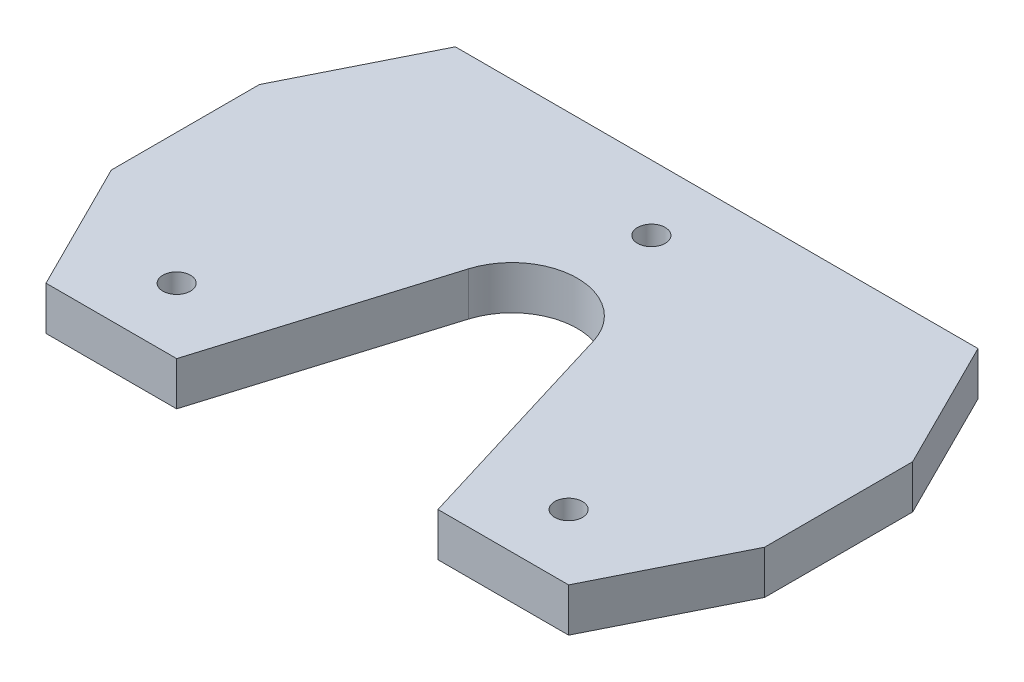
ISO-10303-21;
HEADER;
FILE_DESCRIPTION(('STEP AP214'),'2;1');
FILE_NAME('part.step','',(''),(''),'','','');
FILE_SCHEMA(('AUTOMOTIVE_DESIGN { 1 0 10303 214 1 1 1 1 }'));
ENDSEC;
DATA;
#1=APPLICATION_CONTEXT('core data for automotive mechanical design processes');
#2=APPLICATION_PROTOCOL_DEFINITION('international standard','automotive_design',2000,#1);
#3=PRODUCT_CONTEXT('',#1,'mechanical');
#4=PRODUCT('Part','Part','',(#3));
#5=PRODUCT_RELATED_PRODUCT_CATEGORY('part','',(#4));
#6=PRODUCT_DEFINITION_FORMATION('','',#4);
#7=PRODUCT_DEFINITION_CONTEXT('part definition',#1,'design');
#8=PRODUCT_DEFINITION('design','',#6,#7);
#9=PRODUCT_DEFINITION_SHAPE('','',#8);
#10=(LENGTH_UNIT() NAMED_UNIT(*) SI_UNIT(.MILLI.,.METRE.));
#11=(NAMED_UNIT(*) PLANE_ANGLE_UNIT() SI_UNIT($,.RADIAN.));
#12=(NAMED_UNIT(*) SI_UNIT($,.STERADIAN.) SOLID_ANGLE_UNIT());
#13=UNCERTAINTY_MEASURE_WITH_UNIT(LENGTH_MEASURE(1.E-05),#10,'distance_accuracy_value','');
#14=(GEOMETRIC_REPRESENTATION_CONTEXT(3) GLOBAL_UNCERTAINTY_ASSIGNED_CONTEXT((#13)) GLOBAL_UNIT_ASSIGNED_CONTEXT((#10,
#11,#12)) REPRESENTATION_CONTEXT('',''));
#15=CARTESIAN_POINT('',(0.,0.,0.));
#16=DIRECTION('',(0.,0.,1.));
#17=DIRECTION('',(1.,0.,0.));
#18=AXIS2_PLACEMENT_3D('',#15,#16,#17);
#19=CARTESIAN_POINT('',(-0.0001683117060666,10.,19.6990291262136));
#20=DIRECTION('',(0.,1.,0.));
#21=DIRECTION('',(0.,0.,1.));
#22=AXIS2_PLACEMENT_3D('',#19,#20,#21);
#23=PLANE('',#22);
#24=CARTESIAN_POINT('',(0.,10.,-12.3009708737864));
#25=DIRECTION('',(0.,1.,0.));
#26=DIRECTION('',(0.,0.,1.));
#27=AXIS2_PLACEMENT_3D('',#24,#25,#26);
#28=CIRCLE('',#27,3.175);
#29=CARTESIAN_POINT('',(0.,10.,-9.12597087378638));
#30=VERTEX_POINT('',#29);
#31=EDGE_CURVE('E286',#30,#30,#28,.T.);
#32=ORIENTED_EDGE('',*,*,#31,.F.);
#33=EDGE_LOOP('',(#32));
#34=FACE_BOUND('',#33,.T.);
#35=DIRECTION('',(-0.447213595499958,0.,0.894427190999916));
#36=VECTOR('',#35,1.);
#37=CARTESIAN_POINT('',(-60.,10.,-27.3009708737864));
#38=LINE('',#37,#36);
#39=CARTESIAN_POINT('',(-60.,10.,-27.3009708737864));
#40=VERTEX_POINT('',#39);
#41=CARTESIAN_POINT('',(-75.,10.,2.69902912621361));
#42=VERTEX_POINT('',#41);
#43=EDGE_CURVE('E177',#40,#42,#38,.T.);
#44=ORIENTED_EDGE('',*,*,#43,.T.);
#45=DIRECTION('',(0.,0.,1.));
#46=VECTOR('',#45,1.);
#47=CARTESIAN_POINT('',(-75.,10.,2.69902912621361));
#48=LINE('',#47,#46);
#49=CARTESIAN_POINT('',(-75.,10.,36.6990291262136));
#50=VERTEX_POINT('',#49);
#51=EDGE_CURVE('E105',#42,#50,#48,.T.);
#52=ORIENTED_EDGE('',*,*,#51,.T.);
#53=DIRECTION('',(0.447213595499958,0.,0.894427190999916));
#54=VECTOR('',#53,1.);
#55=CARTESIAN_POINT('',(-75.,10.,36.6990291262136));
#56=LINE('',#55,#54);
#57=CARTESIAN_POINT('',(-60.,10.,66.6990291262136));
#58=VERTEX_POINT('',#57);
#59=EDGE_CURVE('E204',#50,#58,#56,.T.);
#60=ORIENTED_EDGE('',*,*,#59,.T.);
#61=DIRECTION('',(1.,0.,0.));
#62=VECTOR('',#61,1.);
#63=CARTESIAN_POINT('',(-60.,10.,66.6990291262136));
#64=LINE('',#63,#62);
#65=CARTESIAN_POINT('',(-30.,10.,66.6990291262136));
#66=VERTEX_POINT('',#65);
#67=EDGE_CURVE('E223',#58,#66,#64,.T.);
#68=ORIENTED_EDGE('',*,*,#67,.T.);
#69=DIRECTION('',(0.291437013014146,0.,-0.956590020565442));
#70=VECTOR('',#69,1.);
#71=CARTESIAN_POINT('',(-30.,10.,66.6990291262136));
#72=LINE('',#71,#70);
#73=CARTESIAN_POINT('',(-14.3490186201877,10.,15.3274739310014));
#74=VERTEX_POINT('',#73);
#75=EDGE_CURVE('E220',#66,#74,#72,.T.);
#76=ORIENTED_EDGE('',*,*,#75,.T.);
#77=CARTESIAN_POINT('',(-0.0001683117060666,10.,19.6990291262136));
#78=DIRECTION('',(0.,-1.,0.));
#79=DIRECTION('',(0.,0.,1.));
#80=AXIS2_PLACEMENT_3D('',#77,#78,#79);
#81=CIRCLE('',#80,15.);
#82=CARTESIAN_POINT('',(14.348655784038,10.,15.3273878932905));
#83=VERTEX_POINT('',#82);
#84=EDGE_CURVE('E222',#74,#83,#81,.T.);
#85=ORIENTED_EDGE('',*,*,#84,.T.);
#86=DIRECTION('',(0.291442748861541,0.,0.956588273049607));
#87=VECTOR('',#86,1.);
#88=CARTESIAN_POINT('',(30.,10.,66.6990291262136));
#89=LINE('',#88,#87);
#90=CARTESIAN_POINT('',(30.,10.,66.6990291262136));
#91=VERTEX_POINT('',#90);
#92=EDGE_CURVE('E225',#83,#91,#89,.T.);
#93=ORIENTED_EDGE('',*,*,#92,.T.);
#94=DIRECTION('',(1.,0.,0.));
#95=VECTOR('',#94,1.);
#96=CARTESIAN_POINT('',(60.,10.,66.6990291262136));
#97=LINE('',#96,#95);
#98=CARTESIAN_POINT('',(60.,10.,66.6990291262136));
#99=VERTEX_POINT('',#98);
#100=EDGE_CURVE('E231',#91,#99,#97,.T.);
#101=ORIENTED_EDGE('',*,*,#100,.T.);
#102=DIRECTION('',(0.447213595499958,0.,-0.894427190999916));
#103=VECTOR('',#102,1.);
#104=CARTESIAN_POINT('',(75.,10.,36.6990291262136));
#105=LINE('',#104,#103);
#106=CARTESIAN_POINT('',(75.,10.,36.6990291262136));
#107=VERTEX_POINT('',#106);
#108=EDGE_CURVE('E136',#99,#107,#105,.T.);
#109=ORIENTED_EDGE('',*,*,#108,.T.);
#110=DIRECTION('',(0.,0.,-1.));
#111=VECTOR('',#110,1.);
#112=CARTESIAN_POINT('',(75.,10.,2.69902912621361));
#113=LINE('',#112,#111);
#114=CARTESIAN_POINT('',(75.,10.,2.69902912621361));
#115=VERTEX_POINT('',#114);
#116=EDGE_CURVE('E130',#107,#115,#113,.T.);
#117=ORIENTED_EDGE('',*,*,#116,.T.);
#118=DIRECTION('',(-0.447213595499958,0.,-0.894427190999916));
#119=VECTOR('',#118,1.);
#120=CARTESIAN_POINT('',(60.,10.,-27.3009708737864));
#121=LINE('',#120,#119);
#122=CARTESIAN_POINT('',(60.,10.,-27.3009708737864));
#123=VERTEX_POINT('',#122);
#124=EDGE_CURVE('E134',#115,#123,#121,.T.);
#125=ORIENTED_EDGE('',*,*,#124,.T.);
#126=DIRECTION('',(-1.,0.,0.));
#127=VECTOR('',#126,1.);
#128=CARTESIAN_POINT('',(-60.,10.,-27.3009708737864));
#129=LINE('',#128,#127);
#130=EDGE_CURVE('E50',#123,#40,#129,.T.);
#131=ORIENTED_EDGE('',*,*,#130,.T.);
#132=EDGE_LOOP('',(#44,#52,#60,#68,#76,#85,#93,#101,#109,#117,#125,#131));
#133=FACE_BOUND('',#132,.T.);
#134=CARTESIAN_POINT('',(-45.,10.,51.6990291262136));
#135=DIRECTION('',(0.,1.,0.));
#136=DIRECTION('',(0.,0.,1.));
#137=AXIS2_PLACEMENT_3D('',#134,#135,#136);
#138=CIRCLE('',#137,3.175);
#139=CARTESIAN_POINT('',(-45.,10.,54.8740291262136));
#140=VERTEX_POINT('',#139);
#141=EDGE_CURVE('E158',#140,#140,#138,.T.);
#142=ORIENTED_EDGE('',*,*,#141,.F.);
#143=EDGE_LOOP('',(#142));
#144=FACE_BOUND('',#143,.T.);
#145=CARTESIAN_POINT('',(45.,10.,51.6990291262136));
#146=DIRECTION('',(0.,1.,0.));
#147=DIRECTION('',(0.,0.,1.));
#148=AXIS2_PLACEMENT_3D('',#145,#146,#147);
#149=CIRCLE('',#148,3.175);
#150=CARTESIAN_POINT('',(45.,10.,54.8740291262136));
#151=VERTEX_POINT('',#150);
#152=EDGE_CURVE('E277',#151,#151,#149,.T.);
#153=ORIENTED_EDGE('',*,*,#152,.F.);
#154=EDGE_LOOP('',(#153));
#155=FACE_BOUND('',#154,.T.);
#156=ADVANCED_FACE('F33',(#34,#133,#144,#155),#23,.T.);
#157=CARTESIAN_POINT('',(-0.0001683117060666,0.,19.6990291262136));
#158=DIRECTION('',(0.,1.,0.));
#159=DIRECTION('',(0.,0.,1.));
#160=AXIS2_PLACEMENT_3D('',#157,#158,#159);
#161=PLANE('',#160);
#162=DIRECTION('',(-0.447213595499958,0.,0.894427190999916));
#163=VECTOR('',#162,1.);
#164=CARTESIAN_POINT('',(-60.,0.,-27.3009708737864));
#165=LINE('',#164,#163);
#166=CARTESIAN_POINT('',(-60.,0.,-27.3009708737864));
#167=VERTEX_POINT('',#166);
#168=CARTESIAN_POINT('',(-75.,0.,2.69902912621361));
#169=VERTEX_POINT('',#168);
#170=EDGE_CURVE('E154',#167,#169,#165,.T.);
#171=ORIENTED_EDGE('',*,*,#170,.F.);
#172=DIRECTION('',(-1.,0.,0.));
#173=VECTOR('',#172,1.);
#174=CARTESIAN_POINT('',(-60.,0.,-27.3009708737864));
#175=LINE('',#174,#173);
#176=CARTESIAN_POINT('',(60.,0.,-27.3009708737864));
#177=VERTEX_POINT('',#176);
#178=EDGE_CURVE('E97',#177,#167,#175,.T.);
#179=ORIENTED_EDGE('',*,*,#178,.F.);
#180=DIRECTION('',(-0.447213595499958,0.,-0.894427190999916));
#181=VECTOR('',#180,1.);
#182=CARTESIAN_POINT('',(60.,0.,-27.3009708737864));
#183=LINE('',#182,#181);
#184=CARTESIAN_POINT('',(75.,0.,2.69902912621361));
#185=VERTEX_POINT('',#184);
#186=EDGE_CURVE('E91',#185,#177,#183,.T.);
#187=ORIENTED_EDGE('',*,*,#186,.F.);
#188=DIRECTION('',(0.,0.,-1.));
#189=VECTOR('',#188,1.);
#190=CARTESIAN_POINT('',(75.,0.,2.69902912621361));
#191=LINE('',#190,#189);
#192=CARTESIAN_POINT('',(75.,0.,36.6990291262136));
#193=VERTEX_POINT('',#192);
#194=EDGE_CURVE('E144',#193,#185,#191,.T.);
#195=ORIENTED_EDGE('',*,*,#194,.F.);
#196=DIRECTION('',(0.447213595499958,0.,-0.894427190999916));
#197=VECTOR('',#196,1.);
#198=CARTESIAN_POINT('',(75.,0.,36.6990291262136));
#199=LINE('',#198,#197);
#200=CARTESIAN_POINT('',(60.,0.,66.6990291262136));
#201=VERTEX_POINT('',#200);
#202=EDGE_CURVE('E172',#201,#193,#199,.T.);
#203=ORIENTED_EDGE('',*,*,#202,.F.);
#204=DIRECTION('',(1.,0.,0.));
#205=VECTOR('',#204,1.);
#206=CARTESIAN_POINT('',(60.,0.,66.6990291262136));
#207=LINE('',#206,#205);
#208=CARTESIAN_POINT('',(30.,0.,66.6990291262136));
#209=VERTEX_POINT('',#208);
#210=EDGE_CURVE('E170',#209,#201,#207,.T.);
#211=ORIENTED_EDGE('',*,*,#210,.F.);
#212=DIRECTION('',(0.291442748861541,0.,0.956588273049607));
#213=VECTOR('',#212,1.);
#214=CARTESIAN_POINT('',(30.,0.,66.6990291262136));
#215=LINE('',#214,#213);
#216=CARTESIAN_POINT('',(14.348655784038,0.,15.3273878932905));
#217=VERTEX_POINT('',#216);
#218=EDGE_CURVE('E168',#217,#209,#215,.T.);
#219=ORIENTED_EDGE('',*,*,#218,.F.);
#220=CARTESIAN_POINT('',(-0.0001683117060666,0.,19.6990291262136));
#221=DIRECTION('',(0.,-1.,0.));
#222=DIRECTION('',(0.,0.,1.));
#223=AXIS2_PLACEMENT_3D('',#220,#221,#222);
#224=CIRCLE('',#223,15.);
#225=CARTESIAN_POINT('',(-14.3490186201877,0.,15.3274739310014));
#226=VERTEX_POINT('',#225);
#227=EDGE_CURVE('E166',#226,#217,#224,.T.);
#228=ORIENTED_EDGE('',*,*,#227,.F.);
#229=DIRECTION('',(0.291437013014146,0.,-0.956590020565442));
#230=VECTOR('',#229,1.);
#231=CARTESIAN_POINT('',(-30.,0.,66.6990291262136));
#232=LINE('',#231,#230);
#233=CARTESIAN_POINT('',(-30.,0.,66.6990291262136));
#234=VERTEX_POINT('',#233);
#235=EDGE_CURVE('E164',#234,#226,#232,.T.);
#236=ORIENTED_EDGE('',*,*,#235,.F.);
#237=DIRECTION('',(1.,0.,0.));
#238=VECTOR('',#237,1.);
#239=CARTESIAN_POINT('',(-60.,0.,66.6990291262136));
#240=LINE('',#239,#238);
#241=CARTESIAN_POINT('',(-60.,0.,66.6990291262136));
#242=VERTEX_POINT('',#241);
#243=EDGE_CURVE('E162',#242,#234,#240,.T.);
#244=ORIENTED_EDGE('',*,*,#243,.F.);
#245=DIRECTION('',(0.447213595499958,0.,0.894427190999916));
#246=VECTOR('',#245,1.);
#247=CARTESIAN_POINT('',(-75.,0.,36.6990291262136));
#248=LINE('',#247,#246);
#249=CARTESIAN_POINT('',(-75.,0.,36.6990291262136));
#250=VERTEX_POINT('',#249);
#251=EDGE_CURVE('E160',#250,#242,#248,.T.);
#252=ORIENTED_EDGE('',*,*,#251,.F.);
#253=DIRECTION('',(0.,0.,1.));
#254=VECTOR('',#253,1.);
#255=CARTESIAN_POINT('',(-75.,0.,2.69902912621361));
#256=LINE('',#255,#254);
#257=EDGE_CURVE('E157',#169,#250,#256,.T.);
#258=ORIENTED_EDGE('',*,*,#257,.F.);
#259=EDGE_LOOP('',(#171,#179,#187,#195,#203,#211,#219,#228,#236,#244,#252,#258));
#260=FACE_BOUND('',#259,.T.);
#261=CARTESIAN_POINT('',(-45.,0.,51.6990291262136));
#262=DIRECTION('',(0.,1.,0.));
#263=DIRECTION('',(0.,0.,1.));
#264=AXIS2_PLACEMENT_3D('',#261,#262,#263);
#265=CIRCLE('',#264,3.175);
#266=CARTESIAN_POINT('',(-45.,0.,54.8740291262136));
#267=VERTEX_POINT('',#266);
#268=EDGE_CURVE('E289',#267,#267,#265,.T.);
#269=ORIENTED_EDGE('',*,*,#268,.T.);
#270=EDGE_LOOP('',(#269));
#271=FACE_BOUND('',#270,.T.);
#272=CARTESIAN_POINT('',(0.,0.,-12.3009708737864));
#273=DIRECTION('',(0.,1.,0.));
#274=DIRECTION('',(0.,0.,1.));
#275=AXIS2_PLACEMENT_3D('',#272,#273,#274);
#276=CIRCLE('',#275,3.175);
#277=CARTESIAN_POINT('',(0.,0.,-9.12597087378638));
#278=VERTEX_POINT('',#277);
#279=EDGE_CURVE('E283',#278,#278,#276,.T.);
#280=ORIENTED_EDGE('',*,*,#279,.T.);
#281=EDGE_LOOP('',(#280));
#282=FACE_BOUND('',#281,.T.);
#283=CARTESIAN_POINT('',(45.,0.,51.6990291262136));
#284=DIRECTION('',(0.,1.,0.));
#285=DIRECTION('',(0.,0.,1.));
#286=AXIS2_PLACEMENT_3D('',#283,#284,#285);
#287=CIRCLE('',#286,3.175);
#288=CARTESIAN_POINT('',(45.,0.,54.8740291262136));
#289=VERTEX_POINT('',#288);
#290=EDGE_CURVE('E280',#289,#289,#287,.T.);
#291=ORIENTED_EDGE('',*,*,#290,.T.);
#292=EDGE_LOOP('',(#291));
#293=FACE_BOUND('',#292,.T.);
#294=ADVANCED_FACE('F208',(#260,#271,#282,#293),#161,.F.);
#295=CARTESIAN_POINT('',(-60.,10.,-27.3009708737864));
#296=DIRECTION('',(0.894427190999916,0.,0.447213595499958));
#297=DIRECTION('',(0.447213595499958,0.,-0.894427190999916));
#298=AXIS2_PLACEMENT_3D('',#295,#296,#297);
#299=PLANE('',#298);
#300=ORIENTED_EDGE('',*,*,#170,.T.);
#301=DIRECTION('',(0.,-1.,0.));
#302=VECTOR('',#301,1.);
#303=CARTESIAN_POINT('',(-75.,10.,2.69902912621361));
#304=LINE('',#303,#302);
#305=EDGE_CURVE('E11',#42,#169,#304,.T.);
#306=ORIENTED_EDGE('',*,*,#305,.F.);
#307=ORIENTED_EDGE('',*,*,#43,.F.);
#308=DIRECTION('',(0.,-1.,0.));
#309=VECTOR('',#308,1.);
#310=CARTESIAN_POINT('',(-60.,10.,-27.3009708737864));
#311=LINE('',#310,#309);
#312=EDGE_CURVE('E150',#40,#167,#311,.T.);
#313=ORIENTED_EDGE('',*,*,#312,.T.);
#314=EDGE_LOOP('',(#300,#306,#307,#313));
#315=FACE_BOUND('',#314,.T.);
#316=ADVANCED_FACE('F35',(#315),#299,.F.);
#317=CARTESIAN_POINT('',(-75.,10.,2.69902912621361));
#318=DIRECTION('',(1.,0.,0.));
#319=DIRECTION('',(0.,0.,-1.));
#320=AXIS2_PLACEMENT_3D('',#317,#318,#319);
#321=PLANE('',#320);
#322=ORIENTED_EDGE('',*,*,#257,.T.);
#323=DIRECTION('',(0.,-1.,0.));
#324=VECTOR('',#323,1.);
#325=CARTESIAN_POINT('',(-75.,10.,36.6990291262136));
#326=LINE('',#325,#324);
#327=EDGE_CURVE('E42',#50,#250,#326,.T.);
#328=ORIENTED_EDGE('',*,*,#327,.F.);
#329=ORIENTED_EDGE('',*,*,#51,.F.);
#330=ORIENTED_EDGE('',*,*,#305,.T.);
#331=EDGE_LOOP('',(#322,#328,#329,#330));
#332=FACE_BOUND('',#331,.T.);
#333=ADVANCED_FACE('F391',(#332),#321,.F.);
#334=CARTESIAN_POINT('',(-75.,10.,36.6990291262136));
#335=DIRECTION('',(0.894427190999916,0.,-0.447213595499958));
#336=DIRECTION('',(-0.447213595499958,0.,-0.894427190999916));
#337=AXIS2_PLACEMENT_3D('',#334,#335,#336);
#338=PLANE('',#337);
#339=ORIENTED_EDGE('',*,*,#251,.T.);
#340=DIRECTION('',(0.,-1.,0.));
#341=VECTOR('',#340,1.);
#342=CARTESIAN_POINT('',(-60.,10.,66.6990291262136));
#343=LINE('',#342,#341);
#344=EDGE_CURVE('E196',#58,#242,#343,.T.);
#345=ORIENTED_EDGE('',*,*,#344,.F.);
#346=ORIENTED_EDGE('',*,*,#59,.F.);
#347=ORIENTED_EDGE('',*,*,#327,.T.);
#348=EDGE_LOOP('',(#339,#345,#346,#347));
#349=FACE_BOUND('',#348,.T.);
#350=ADVANCED_FACE('F202',(#349),#338,.F.);
#351=CARTESIAN_POINT('',(-60.,10.,66.6990291262136));
#352=DIRECTION('',(0.,0.,-1.));
#353=DIRECTION('',(-1.,0.,0.));
#354=AXIS2_PLACEMENT_3D('',#351,#352,#353);
#355=PLANE('',#354);
#356=ORIENTED_EDGE('',*,*,#243,.T.);
#357=DIRECTION('',(0.,-1.,0.));
#358=VECTOR('',#357,1.);
#359=CARTESIAN_POINT('',(-30.,10.,66.6990291262136));
#360=LINE('',#359,#358);
#361=EDGE_CURVE('E193',#66,#234,#360,.T.);
#362=ORIENTED_EDGE('',*,*,#361,.F.);
#363=ORIENTED_EDGE('',*,*,#67,.F.);
#364=ORIENTED_EDGE('',*,*,#344,.T.);
#365=EDGE_LOOP('',(#356,#362,#363,#364));
#366=FACE_BOUND('',#365,.T.);
#367=ADVANCED_FACE('F214',(#366),#355,.F.);
#368=CARTESIAN_POINT('',(-30.,10.,66.6990291262136));
#369=DIRECTION('',(-0.956590020565442,0.,-0.291437013014146));
#370=DIRECTION('',(-0.291437013014146,0.,0.956590020565442));
#371=AXIS2_PLACEMENT_3D('',#368,#369,#370);
#372=PLANE('',#371);
#373=ORIENTED_EDGE('',*,*,#235,.T.);
#374=DIRECTION('',(0.,-1.,0.));
#375=VECTOR('',#374,1.);
#376=CARTESIAN_POINT('',(-14.3490186201877,10.,15.3274739310014));
#377=LINE('',#376,#375);
#378=EDGE_CURVE('E190',#74,#226,#377,.T.);
#379=ORIENTED_EDGE('',*,*,#378,.F.);
#380=ORIENTED_EDGE('',*,*,#75,.F.);
#381=ORIENTED_EDGE('',*,*,#361,.T.);
#382=EDGE_LOOP('',(#373,#379,#380,#381));
#383=FACE_BOUND('',#382,.T.);
#384=ADVANCED_FACE('F218',(#383),#372,.F.);
#385=CARTESIAN_POINT('',(-0.0001683117060666,10.,19.6990291262136));
#386=DIRECTION('',(0.,-1.,0.));
#387=DIRECTION('',(0.,0.,-1.));
#388=AXIS2_PLACEMENT_3D('',#385,#386,#387);
#389=CYLINDRICAL_SURFACE('',#388,15.);
#390=ORIENTED_EDGE('',*,*,#227,.T.);
#391=DIRECTION('',(0.,-1.,0.));
#392=VECTOR('',#391,1.);
#393=CARTESIAN_POINT('',(14.348655784038,10.,15.3273878932905));
#394=LINE('',#393,#392);
#395=EDGE_CURVE('E187',#83,#217,#394,.T.);
#396=ORIENTED_EDGE('',*,*,#395,.F.);
#397=ORIENTED_EDGE('',*,*,#84,.F.);
#398=ORIENTED_EDGE('',*,*,#378,.T.);
#399=EDGE_LOOP('',(#390,#396,#397,#398));
#400=FACE_BOUND('',#399,.T.);
#401=ADVANCED_FACE('F356',(#400),#389,.F.);
#402=CARTESIAN_POINT('',(30.,10.,66.6990291262136));
#403=DIRECTION('',(0.956588273049607,0.,-0.291442748861541));
#404=DIRECTION('',(-0.291442748861541,0.,-0.956588273049607));
#405=AXIS2_PLACEMENT_3D('',#402,#403,#404);
#406=PLANE('',#405);
#407=ORIENTED_EDGE('',*,*,#218,.T.);
#408=DIRECTION('',(0.,-1.,0.));
#409=VECTOR('',#408,1.);
#410=CARTESIAN_POINT('',(30.,10.,66.6990291262136));
#411=LINE('',#410,#409);
#412=EDGE_CURVE('E184',#91,#209,#411,.T.);
#413=ORIENTED_EDGE('',*,*,#412,.F.);
#414=ORIENTED_EDGE('',*,*,#92,.F.);
#415=ORIENTED_EDGE('',*,*,#395,.T.);
#416=EDGE_LOOP('',(#407,#413,#414,#415));
#417=FACE_BOUND('',#416,.T.);
#418=ADVANCED_FACE('F347',(#417),#406,.F.);
#419=CARTESIAN_POINT('',(60.,10.,66.6990291262136));
#420=DIRECTION('',(0.,0.,-1.));
#421=DIRECTION('',(-1.,0.,0.));
#422=AXIS2_PLACEMENT_3D('',#419,#420,#421);
#423=PLANE('',#422);
#424=ORIENTED_EDGE('',*,*,#210,.T.);
#425=DIRECTION('',(0.,-1.,0.));
#426=VECTOR('',#425,1.);
#427=CARTESIAN_POINT('',(60.,10.,66.6990291262136));
#428=LINE('',#427,#426);
#429=EDGE_CURVE('E181',#99,#201,#428,.T.);
#430=ORIENTED_EDGE('',*,*,#429,.F.);
#431=ORIENTED_EDGE('',*,*,#100,.F.);
#432=ORIENTED_EDGE('',*,*,#412,.T.);
#433=EDGE_LOOP('',(#424,#430,#431,#432));
#434=FACE_BOUND('',#433,.T.);
#435=ADVANCED_FACE('F237',(#434),#423,.F.);
#436=CARTESIAN_POINT('',(75.,10.,36.6990291262136));
#437=DIRECTION('',(-0.894427190999916,0.,-0.447213595499958));
#438=DIRECTION('',(-0.447213595499958,0.,0.894427190999916));
#439=AXIS2_PLACEMENT_3D('',#436,#437,#438);
#440=PLANE('',#439);
#441=ORIENTED_EDGE('',*,*,#202,.T.);
#442=DIRECTION('',(0.,-1.,0.));
#443=VECTOR('',#442,1.);
#444=CARTESIAN_POINT('',(75.,10.,36.6990291262136));
#445=LINE('',#444,#443);
#446=EDGE_CURVE('E145',#107,#193,#445,.T.);
#447=ORIENTED_EDGE('',*,*,#446,.F.);
#448=ORIENTED_EDGE('',*,*,#108,.F.);
#449=ORIENTED_EDGE('',*,*,#429,.T.);
#450=EDGE_LOOP('',(#441,#447,#448,#449));
#451=FACE_BOUND('',#450,.T.);
#452=ADVANCED_FACE('F241',(#451),#440,.F.);
#453=CARTESIAN_POINT('',(75.,10.,2.69902912621361));
#454=DIRECTION('',(-1.,0.,0.));
#455=DIRECTION('',(0.,0.,1.));
#456=AXIS2_PLACEMENT_3D('',#453,#454,#455);
#457=PLANE('',#456);
#458=ORIENTED_EDGE('',*,*,#194,.T.);
#459=DIRECTION('',(0.,-1.,0.));
#460=VECTOR('',#459,1.);
#461=CARTESIAN_POINT('',(75.,10.,2.69902912621361));
#462=LINE('',#461,#460);
#463=EDGE_CURVE('E141',#115,#185,#462,.T.);
#464=ORIENTED_EDGE('',*,*,#463,.F.);
#465=ORIENTED_EDGE('',*,*,#116,.F.);
#466=ORIENTED_EDGE('',*,*,#446,.T.);
#467=EDGE_LOOP('',(#458,#464,#465,#466));
#468=FACE_BOUND('',#467,.T.);
#469=ADVANCED_FACE('F142',(#468),#457,.F.);
#470=CARTESIAN_POINT('',(60.,10.,-27.3009708737864));
#471=DIRECTION('',(-0.894427190999916,0.,0.447213595499958));
#472=DIRECTION('',(0.447213595499958,0.,0.894427190999916));
#473=AXIS2_PLACEMENT_3D('',#470,#471,#472);
#474=PLANE('',#473);
#475=ORIENTED_EDGE('',*,*,#186,.T.);
#476=DIRECTION('',(0.,-1.,0.));
#477=VECTOR('',#476,1.);
#478=CARTESIAN_POINT('',(60.,10.,-27.3009708737864));
#479=LINE('',#478,#477);
#480=EDGE_CURVE('E146',#123,#177,#479,.T.);
#481=ORIENTED_EDGE('',*,*,#480,.F.);
#482=ORIENTED_EDGE('',*,*,#124,.F.);
#483=ORIENTED_EDGE('',*,*,#463,.T.);
#484=EDGE_LOOP('',(#475,#481,#482,#483));
#485=FACE_BOUND('',#484,.T.);
#486=ADVANCED_FACE('F148',(#485),#474,.F.);
#487=CARTESIAN_POINT('',(-60.,10.,-27.3009708737864));
#488=DIRECTION('',(0.,0.,1.));
#489=DIRECTION('',(1.,0.,0.));
#490=AXIS2_PLACEMENT_3D('',#487,#488,#489);
#491=PLANE('',#490);
#492=ORIENTED_EDGE('',*,*,#178,.T.);
#493=ORIENTED_EDGE('',*,*,#312,.F.);
#494=ORIENTED_EDGE('',*,*,#130,.F.);
#495=ORIENTED_EDGE('',*,*,#480,.T.);
#496=EDGE_LOOP('',(#492,#493,#494,#495));
#497=FACE_BOUND('',#496,.T.);
#498=ADVANCED_FACE('F245',(#497),#491,.F.);
#499=CARTESIAN_POINT('',(-45.,10.,51.6990291262136));
#500=DIRECTION('',(0.,-1.,0.));
#501=DIRECTION('',(0.,0.,-1.));
#502=AXIS2_PLACEMENT_3D('',#499,#500,#501);
#503=CYLINDRICAL_SURFACE('',#502,3.175);
#504=ORIENTED_EDGE('',*,*,#141,.T.);
#505=EDGE_LOOP('',(#504));
#506=FACE_BOUND('',#505,.T.);
#507=ORIENTED_EDGE('',*,*,#268,.F.);
#508=EDGE_LOOP('',(#507));
#509=FACE_BOUND('',#508,.T.);
#510=ADVANCED_FACE('F247',(#506,#509),#503,.F.);
#511=CARTESIAN_POINT('',(0.,10.,-12.3009708737864));
#512=DIRECTION('',(0.,-1.,0.));
#513=DIRECTION('',(0.,0.,-1.));
#514=AXIS2_PLACEMENT_3D('',#511,#512,#513);
#515=CYLINDRICAL_SURFACE('',#514,3.175);
#516=ORIENTED_EDGE('',*,*,#31,.T.);
#517=EDGE_LOOP('',(#516));
#518=FACE_BOUND('',#517,.T.);
#519=ORIENTED_EDGE('',*,*,#279,.F.);
#520=EDGE_LOOP('',(#519));
#521=FACE_BOUND('',#520,.T.);
#522=ADVANCED_FACE('F253',(#518,#521),#515,.F.);
#523=CARTESIAN_POINT('',(45.,10.,51.6990291262136));
#524=DIRECTION('',(0.,-1.,0.));
#525=DIRECTION('',(0.,0.,-1.));
#526=AXIS2_PLACEMENT_3D('',#523,#524,#525);
#527=CYLINDRICAL_SURFACE('',#526,3.175);
#528=ORIENTED_EDGE('',*,*,#152,.T.);
#529=EDGE_LOOP('',(#528));
#530=FACE_BOUND('',#529,.T.);
#531=ORIENTED_EDGE('',*,*,#290,.F.);
#532=EDGE_LOOP('',(#531));
#533=FACE_BOUND('',#532,.T.);
#534=ADVANCED_FACE('F268',(#530,#533),#527,.F.);
#535=CLOSED_SHELL('',(#156,#294,#316,#333,#350,#367,#384,#401,#418,#435,#452,#469,#486,#498,
#510,#522,#534));
#536=MANIFOLD_SOLID_BREP('B2',#535);
#537=ADVANCED_BREP_SHAPE_REPRESENTATION('',(#18,#536),#14);
#538=SHAPE_DEFINITION_REPRESENTATION(#9,#537);
ENDSEC;
END-ISO-10303-21;
